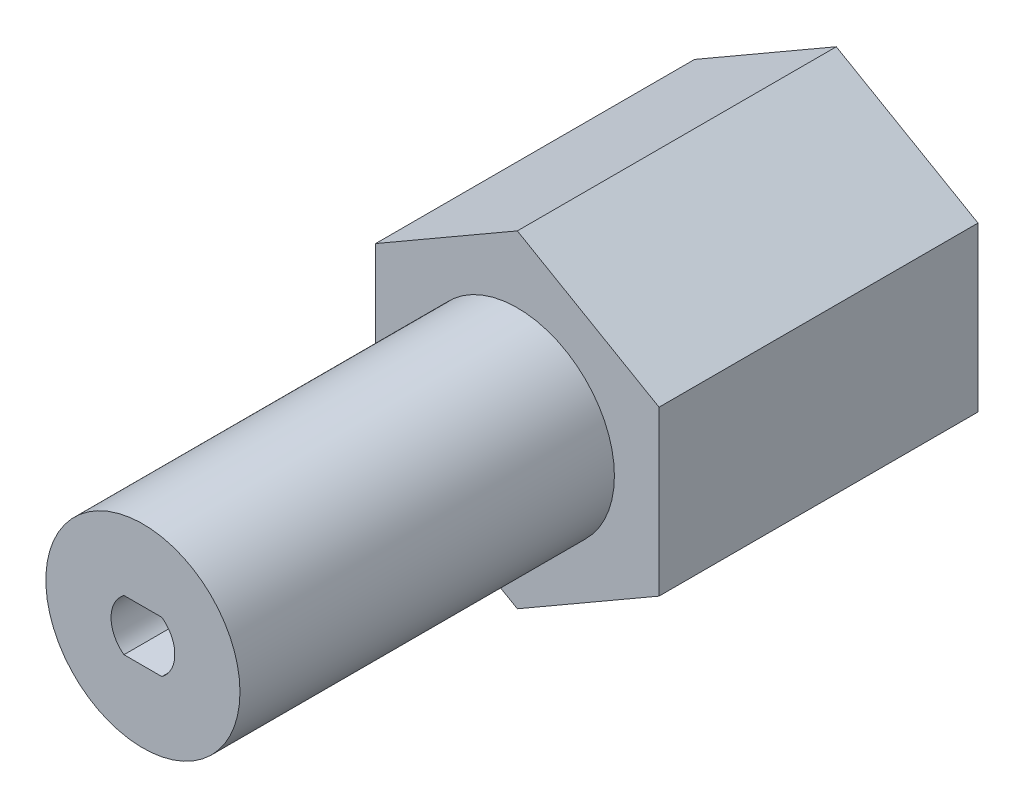
ISO-10303-21;
HEADER;
FILE_DESCRIPTION(('STEP AP214'),'2;1');
FILE_NAME('part.step','',(''),(''),'','','');
FILE_SCHEMA(('AUTOMOTIVE_DESIGN { 1 0 10303 214 1 1 1 1 }'));
ENDSEC;
DATA;
#1=APPLICATION_CONTEXT('core data for automotive mechanical design processes');
#2=APPLICATION_PROTOCOL_DEFINITION('international standard','automotive_design',2000,#1);
#3=PRODUCT_CONTEXT('',#1,'mechanical');
#4=PRODUCT('Part','Part','',(#3));
#5=PRODUCT_RELATED_PRODUCT_CATEGORY('part','',(#4));
#6=PRODUCT_DEFINITION_FORMATION('','',#4);
#7=PRODUCT_DEFINITION_CONTEXT('part definition',#1,'design');
#8=PRODUCT_DEFINITION('design','',#6,#7);
#9=PRODUCT_DEFINITION_SHAPE('','',#8);
#10=(LENGTH_UNIT() NAMED_UNIT(*) SI_UNIT(.MILLI.,.METRE.));
#11=(NAMED_UNIT(*) PLANE_ANGLE_UNIT() SI_UNIT($,.RADIAN.));
#12=(NAMED_UNIT(*) SI_UNIT($,.STERADIAN.) SOLID_ANGLE_UNIT());
#13=UNCERTAINTY_MEASURE_WITH_UNIT(LENGTH_MEASURE(1.E-05),#10,'distance_accuracy_value','');
#14=(GEOMETRIC_REPRESENTATION_CONTEXT(3) GLOBAL_UNCERTAINTY_ASSIGNED_CONTEXT((#13)) GLOBAL_UNIT_ASSIGNED_CONTEXT((#10,
#11,#12)) REPRESENTATION_CONTEXT('',''));
#15=CARTESIAN_POINT('',(0.,0.,0.));
#16=DIRECTION('',(0.,0.,1.));
#17=DIRECTION('',(1.,0.,0.));
#18=AXIS2_PLACEMENT_3D('',#15,#16,#17);
#19=CARTESIAN_POINT('',(0.,-5.9,11.5));
#20=DIRECTION('',(-0.5,0.866025403784439,0.));
#21=DIRECTION('',(-0.866025403784439,-0.5,0.));
#22=AXIS2_PLACEMENT_3D('',#19,#20,#21);
#23=PLANE('',#22);
#24=DIRECTION('',(0.866025403784439,0.5,0.));
#25=VECTOR('',#24,1.);
#26=CARTESIAN_POINT('',(0.,-5.9,0.));
#27=LINE('',#26,#25);
#28=CARTESIAN_POINT('',(0.,-5.9,0.));
#29=VERTEX_POINT('',#28);
#30=CARTESIAN_POINT('',(5.10954988232818,-2.95,0.));
#31=VERTEX_POINT('',#30);
#32=EDGE_CURVE('E152',#29,#31,#27,.T.);
#33=ORIENTED_EDGE('',*,*,#32,.T.);
#34=DIRECTION('',(0.,0.,-1.));
#35=VECTOR('',#34,1.);
#36=CARTESIAN_POINT('',(5.10954988232818,-2.95,11.5));
#37=LINE('',#36,#35);
#38=CARTESIAN_POINT('',(5.10954988232818,-2.95,11.5));
#39=VERTEX_POINT('',#38);
#40=EDGE_CURVE('E40',#39,#31,#37,.T.);
#41=ORIENTED_EDGE('',*,*,#40,.F.);
#42=DIRECTION('',(0.866025403784439,0.5,0.));
#43=VECTOR('',#42,1.);
#44=CARTESIAN_POINT('',(0.,-5.9,11.5));
#45=LINE('',#44,#43);
#46=CARTESIAN_POINT('',(0.,-5.9,11.5));
#47=VERTEX_POINT('',#46);
#48=EDGE_CURVE('E154',#47,#39,#45,.T.);
#49=ORIENTED_EDGE('',*,*,#48,.F.);
#50=DIRECTION('',(0.,0.,-1.));
#51=VECTOR('',#50,1.);
#52=CARTESIAN_POINT('',(0.,-5.9,11.5));
#53=LINE('',#52,#51);
#54=EDGE_CURVE('E168',#47,#29,#53,.T.);
#55=ORIENTED_EDGE('',*,*,#54,.T.);
#56=EDGE_LOOP('',(#33,#41,#49,#55));
#57=FACE_BOUND('',#56,.T.);
#58=ADVANCED_FACE('F37',(#57),#23,.F.);
#59=CARTESIAN_POINT('',(5.10954988232818,-2.95,11.5));
#60=DIRECTION('',(-1.,0.,0.));
#61=DIRECTION('',(0.,0.,1.));
#62=AXIS2_PLACEMENT_3D('',#59,#60,#61);
#63=PLANE('',#62);
#64=DIRECTION('',(0.,1.,0.));
#65=VECTOR('',#64,1.);
#66=CARTESIAN_POINT('',(5.10954988232818,-2.95,0.));
#67=LINE('',#66,#65);
#68=CARTESIAN_POINT('',(5.10954988232818,2.95,0.));
#69=VERTEX_POINT('',#68);
#70=EDGE_CURVE('E171',#31,#69,#67,.T.);
#71=ORIENTED_EDGE('',*,*,#70,.T.);
#72=DIRECTION('',(0.,0.,-1.));
#73=VECTOR('',#72,1.);
#74=CARTESIAN_POINT('',(5.10954988232818,2.95,11.5));
#75=LINE('',#74,#73);
#76=CARTESIAN_POINT('',(5.10954988232818,2.95,11.5));
#77=VERTEX_POINT('',#76);
#78=EDGE_CURVE('E190',#77,#69,#75,.T.);
#79=ORIENTED_EDGE('',*,*,#78,.F.);
#80=DIRECTION('',(0.,1.,0.));
#81=VECTOR('',#80,1.);
#82=CARTESIAN_POINT('',(5.10954988232818,-2.95,11.5));
#83=LINE('',#82,#81);
#84=EDGE_CURVE('E157',#39,#77,#83,.T.);
#85=ORIENTED_EDGE('',*,*,#84,.F.);
#86=ORIENTED_EDGE('',*,*,#40,.T.);
#87=EDGE_LOOP('',(#71,#79,#85,#86));
#88=FACE_BOUND('',#87,.T.);
#89=ADVANCED_FACE('F199',(#88),#63,.F.);
#90=CARTESIAN_POINT('',(5.10954988232818,2.95,11.5));
#91=DIRECTION('',(-0.5,-0.866025403784439,0.));
#92=DIRECTION('',(0.866025403784439,-0.5,0.));
#93=AXIS2_PLACEMENT_3D('',#90,#91,#92);
#94=PLANE('',#93);
#95=DIRECTION('',(-0.866025403784439,0.5,0.));
#96=VECTOR('',#95,1.);
#97=CARTESIAN_POINT('',(5.10954988232818,2.95,0.));
#98=LINE('',#97,#96);
#99=CARTESIAN_POINT('',(0.,5.9,0.));
#100=VERTEX_POINT('',#99);
#101=EDGE_CURVE('E173',#69,#100,#98,.T.);
#102=ORIENTED_EDGE('',*,*,#101,.T.);
#103=DIRECTION('',(0.,0.,-1.));
#104=VECTOR('',#103,1.);
#105=CARTESIAN_POINT('',(0.,5.9,11.5));
#106=LINE('',#105,#104);
#107=CARTESIAN_POINT('',(0.,5.9,11.5));
#108=VERTEX_POINT('',#107);
#109=EDGE_CURVE('E188',#108,#100,#106,.T.);
#110=ORIENTED_EDGE('',*,*,#109,.F.);
#111=DIRECTION('',(-0.866025403784439,0.5,0.));
#112=VECTOR('',#111,1.);
#113=CARTESIAN_POINT('',(5.10954988232818,2.95,11.5));
#114=LINE('',#113,#112);
#115=EDGE_CURVE('E160',#77,#108,#114,.T.);
#116=ORIENTED_EDGE('',*,*,#115,.F.);
#117=ORIENTED_EDGE('',*,*,#78,.T.);
#118=EDGE_LOOP('',(#102,#110,#116,#117));
#119=FACE_BOUND('',#118,.T.);
#120=ADVANCED_FACE('F208',(#119),#94,.F.);
#121=CARTESIAN_POINT('',(0.,5.9,11.5));
#122=DIRECTION('',(0.5,-0.866025403784439,0.));
#123=DIRECTION('',(0.866025403784439,0.5,0.));
#124=AXIS2_PLACEMENT_3D('',#121,#122,#123);
#125=PLANE('',#124);
#126=DIRECTION('',(-0.866025403784439,-0.5,0.));
#127=VECTOR('',#126,1.);
#128=CARTESIAN_POINT('',(0.,5.9,0.));
#129=LINE('',#128,#127);
#130=CARTESIAN_POINT('',(-5.10954988232819,2.95,0.));
#131=VERTEX_POINT('',#130);
#132=EDGE_CURVE('E175',#100,#131,#129,.T.);
#133=ORIENTED_EDGE('',*,*,#132,.T.);
#134=DIRECTION('',(0.,0.,-1.));
#135=VECTOR('',#134,1.);
#136=CARTESIAN_POINT('',(-5.10954988232819,2.95,11.5));
#137=LINE('',#136,#135);
#138=CARTESIAN_POINT('',(-5.10954988232819,2.95,11.5));
#139=VERTEX_POINT('',#138);
#140=EDGE_CURVE('E185',#139,#131,#137,.T.);
#141=ORIENTED_EDGE('',*,*,#140,.F.);
#142=DIRECTION('',(-0.866025403784439,-0.5,0.));
#143=VECTOR('',#142,1.);
#144=CARTESIAN_POINT('',(0.,5.9,11.5));
#145=LINE('',#144,#143);
#146=EDGE_CURVE('E162',#108,#139,#145,.T.);
#147=ORIENTED_EDGE('',*,*,#146,.F.);
#148=ORIENTED_EDGE('',*,*,#109,.T.);
#149=EDGE_LOOP('',(#133,#141,#147,#148));
#150=FACE_BOUND('',#149,.T.);
#151=ADVANCED_FACE('F211',(#150),#125,.F.);
#152=CARTESIAN_POINT('',(-5.10954988232819,2.95,11.5));
#153=DIRECTION('',(1.,0.,0.));
#154=DIRECTION('',(0.,0.,-1.));
#155=AXIS2_PLACEMENT_3D('',#152,#153,#154);
#156=PLANE('',#155);
#157=DIRECTION('',(0.,-1.,0.));
#158=VECTOR('',#157,1.);
#159=CARTESIAN_POINT('',(-5.10954988232819,2.95,0.));
#160=LINE('',#159,#158);
#161=CARTESIAN_POINT('',(-5.10954988232819,-2.95,0.));
#162=VERTEX_POINT('',#161);
#163=EDGE_CURVE('E177',#131,#162,#160,.T.);
#164=ORIENTED_EDGE('',*,*,#163,.T.);
#165=DIRECTION('',(0.,0.,-1.));
#166=VECTOR('',#165,1.);
#167=CARTESIAN_POINT('',(-5.10954988232819,-2.95,11.5));
#168=LINE('',#167,#166);
#169=CARTESIAN_POINT('',(-5.10954988232819,-2.95,11.5));
#170=VERTEX_POINT('',#169);
#171=EDGE_CURVE('E182',#170,#162,#168,.T.);
#172=ORIENTED_EDGE('',*,*,#171,.F.);
#173=DIRECTION('',(0.,-1.,0.));
#174=VECTOR('',#173,1.);
#175=CARTESIAN_POINT('',(-5.10954988232819,2.95,11.5));
#176=LINE('',#175,#174);
#177=EDGE_CURVE('E164',#139,#170,#176,.T.);
#178=ORIENTED_EDGE('',*,*,#177,.F.);
#179=ORIENTED_EDGE('',*,*,#140,.T.);
#180=EDGE_LOOP('',(#164,#172,#178,#179));
#181=FACE_BOUND('',#180,.T.);
#182=ADVANCED_FACE('F221',(#181),#156,.F.);
#183=CARTESIAN_POINT('',(-5.10954988232819,-2.95,11.5));
#184=DIRECTION('',(0.5,0.866025403784438,0.));
#185=DIRECTION('',(-0.866025403784438,0.5,0.));
#186=AXIS2_PLACEMENT_3D('',#183,#184,#185);
#187=PLANE('',#186);
#188=DIRECTION('',(0.866025403784438,-0.5,0.));
#189=VECTOR('',#188,1.);
#190=CARTESIAN_POINT('',(-5.10954988232819,-2.95,0.));
#191=LINE('',#190,#189);
#192=EDGE_CURVE('E158',#162,#29,#191,.T.);
#193=ORIENTED_EDGE('',*,*,#192,.T.);
#194=ORIENTED_EDGE('',*,*,#54,.F.);
#195=DIRECTION('',(0.866025403784438,-0.5,0.));
#196=VECTOR('',#195,1.);
#197=CARTESIAN_POINT('',(-5.10954988232819,-2.95,11.5));
#198=LINE('',#197,#196);
#199=EDGE_CURVE('E166',#170,#47,#198,.T.);
#200=ORIENTED_EDGE('',*,*,#199,.F.);
#201=ORIENTED_EDGE('',*,*,#171,.T.);
#202=EDGE_LOOP('',(#193,#194,#200,#201));
#203=FACE_BOUND('',#202,.T.);
#204=ADVANCED_FACE('F219',(#203),#187,.F.);
#205=CARTESIAN_POINT('',(0.,0.,11.5));
#206=DIRECTION('',(0.,0.,1.));
#207=DIRECTION('',(1.,0.,0.));
#208=AXIS2_PLACEMENT_3D('',#205,#206,#207);
#209=PLANE('',#208);
#210=CARTESIAN_POINT('',(0.,0.,11.5));
#211=DIRECTION('',(0.,0.,1.));
#212=DIRECTION('',(1.,0.,0.));
#213=AXIS2_PLACEMENT_3D('',#210,#211,#212);
#214=CIRCLE('',#213,3.5);
#215=CARTESIAN_POINT('',(3.5,0.,11.5));
#216=VERTEX_POINT('',#215);
#217=EDGE_CURVE('E11',#216,#216,#214,.T.);
#218=ORIENTED_EDGE('',*,*,#217,.F.);
#219=EDGE_LOOP('',(#218));
#220=FACE_BOUND('',#219,.T.);
#221=ORIENTED_EDGE('',*,*,#48,.T.);
#222=ORIENTED_EDGE('',*,*,#84,.T.);
#223=ORIENTED_EDGE('',*,*,#115,.T.);
#224=ORIENTED_EDGE('',*,*,#146,.T.);
#225=ORIENTED_EDGE('',*,*,#177,.T.);
#226=ORIENTED_EDGE('',*,*,#199,.T.);
#227=EDGE_LOOP('',(#221,#222,#223,#224,#225,#226));
#228=FACE_BOUND('',#227,.T.);
#229=ADVANCED_FACE('F215',(#220,#228),#209,.T.);
#230=CARTESIAN_POINT('',(0.,0.,0.));
#231=DIRECTION('',(0.,0.,1.));
#232=DIRECTION('',(1.,0.,0.));
#233=AXIS2_PLACEMENT_3D('',#230,#231,#232);
#234=PLANE('',#233);
#235=DIRECTION('',(-1.,0.,0.));
#236=VECTOR('',#235,1.);
#237=CARTESIAN_POINT('',(-0.683282518435823,0.925,0.));
#238=LINE('',#237,#236);
#239=CARTESIAN_POINT('',(0.683282518435823,0.925,0.));
#240=VERTEX_POINT('',#239);
#241=CARTESIAN_POINT('',(-0.683282518435823,0.925,0.));
#242=VERTEX_POINT('',#241);
#243=EDGE_CURVE('E122',#240,#242,#238,.T.);
#244=ORIENTED_EDGE('',*,*,#243,.T.);
#245=CARTESIAN_POINT('',(0.,0.,0.));
#246=DIRECTION('',(0.,0.,1.));
#247=DIRECTION('',(-1.,0.,0.));
#248=AXIS2_PLACEMENT_3D('',#245,#246,#247);
#249=CIRCLE('',#248,1.15);
#250=CARTESIAN_POINT('',(-0.683282518435823,-0.925,0.));
#251=VERTEX_POINT('',#250);
#252=EDGE_CURVE('E116',#242,#251,#249,.T.);
#253=ORIENTED_EDGE('',*,*,#252,.T.);
#254=DIRECTION('',(1.,0.,0.));
#255=VECTOR('',#254,1.);
#256=CARTESIAN_POINT('',(-0.683282518435823,-0.925,0.));
#257=LINE('',#256,#255);
#258=CARTESIAN_POINT('',(0.683282518435822,-0.925,0.));
#259=VERTEX_POINT('',#258);
#260=EDGE_CURVE('E125',#251,#259,#257,.T.);
#261=ORIENTED_EDGE('',*,*,#260,.T.);
#262=CARTESIAN_POINT('',(0.,0.,0.));
#263=DIRECTION('',(0.,0.,1.));
#264=DIRECTION('',(-1.,0.,0.));
#265=AXIS2_PLACEMENT_3D('',#262,#263,#264);
#266=CIRCLE('',#265,1.15);
#267=EDGE_CURVE('E52',#259,#240,#266,.T.);
#268=ORIENTED_EDGE('',*,*,#267,.T.);
#269=EDGE_LOOP('',(#244,#253,#261,#268));
#270=FACE_BOUND('',#269,.T.);
#271=ORIENTED_EDGE('',*,*,#32,.F.);
#272=ORIENTED_EDGE('',*,*,#192,.F.);
#273=ORIENTED_EDGE('',*,*,#163,.F.);
#274=ORIENTED_EDGE('',*,*,#132,.F.);
#275=ORIENTED_EDGE('',*,*,#101,.F.);
#276=ORIENTED_EDGE('',*,*,#70,.F.);
#277=EDGE_LOOP('',(#271,#272,#273,#274,#275,#276));
#278=FACE_BOUND('',#277,.T.);
#279=ADVANCED_FACE('F129',(#270,#278),#234,.F.);
#280=CARTESIAN_POINT('',(0.,0.,25.));
#281=DIRECTION('',(0.,0.,-1.));
#282=DIRECTION('',(-1.,0.,0.));
#283=AXIS2_PLACEMENT_3D('',#280,#281,#282);
#284=CYLINDRICAL_SURFACE('',#283,3.5);
#285=CARTESIAN_POINT('',(0.,0.,25.));
#286=DIRECTION('',(0.,0.,1.));
#287=DIRECTION('',(1.,0.,0.));
#288=AXIS2_PLACEMENT_3D('',#285,#286,#287);
#289=CIRCLE('',#288,3.5);
#290=CARTESIAN_POINT('',(3.5,0.,25.));
#291=VERTEX_POINT('',#290);
#292=EDGE_CURVE('E147',#291,#291,#289,.T.);
#293=ORIENTED_EDGE('',*,*,#292,.F.);
#294=EDGE_LOOP('',(#293));
#295=FACE_BOUND('',#294,.T.);
#296=ORIENTED_EDGE('',*,*,#217,.T.);
#297=EDGE_LOOP('',(#296));
#298=FACE_BOUND('',#297,.T.);
#299=ADVANCED_FACE('F274',(#295,#298),#284,.T.);
#300=CARTESIAN_POINT('',(0.,0.,25.));
#301=DIRECTION('',(0.,0.,1.));
#302=DIRECTION('',(1.,0.,0.));
#303=AXIS2_PLACEMENT_3D('',#300,#301,#302);
#304=PLANE('',#303);
#305=CARTESIAN_POINT('',(0.,0.,25.));
#306=DIRECTION('',(0.,0.,1.));
#307=DIRECTION('',(-1.,0.,0.));
#308=AXIS2_PLACEMENT_3D('',#305,#306,#307);
#309=CIRCLE('',#308,1.15);
#310=CARTESIAN_POINT('',(-0.683282518435823,0.925,25.));
#311=VERTEX_POINT('',#310);
#312=CARTESIAN_POINT('',(-0.683282518435823,-0.925,25.));
#313=VERTEX_POINT('',#312);
#314=EDGE_CURVE('E60',#311,#313,#309,.T.);
#315=ORIENTED_EDGE('',*,*,#314,.F.);
#316=DIRECTION('',(-1.,0.,0.));
#317=VECTOR('',#316,1.);
#318=CARTESIAN_POINT('',(-0.683282518435823,0.925,25.));
#319=LINE('',#318,#317);
#320=CARTESIAN_POINT('',(0.683282518435823,0.925,25.));
#321=VERTEX_POINT('',#320);
#322=EDGE_CURVE('E132',#321,#311,#319,.T.);
#323=ORIENTED_EDGE('',*,*,#322,.F.);
#324=CARTESIAN_POINT('',(0.,0.,25.));
#325=DIRECTION('',(0.,0.,1.));
#326=DIRECTION('',(-1.,0.,0.));
#327=AXIS2_PLACEMENT_3D('',#324,#325,#326);
#328=CIRCLE('',#327,1.15);
#329=CARTESIAN_POINT('',(0.683282518435822,-0.925,25.));
#330=VERTEX_POINT('',#329);
#331=EDGE_CURVE('E135',#330,#321,#328,.T.);
#332=ORIENTED_EDGE('',*,*,#331,.F.);
#333=DIRECTION('',(1.,0.,0.));
#334=VECTOR('',#333,1.);
#335=CARTESIAN_POINT('',(-0.683282518435823,-0.925,25.));
#336=LINE('',#335,#334);
#337=EDGE_CURVE('E141',#313,#330,#336,.T.);
#338=ORIENTED_EDGE('',*,*,#337,.F.);
#339=EDGE_LOOP('',(#315,#323,#332,#338));
#340=FACE_BOUND('',#339,.T.);
#341=ORIENTED_EDGE('',*,*,#292,.T.);
#342=EDGE_LOOP('',(#341));
#343=FACE_BOUND('',#342,.T.);
#344=ADVANCED_FACE('F279',(#340,#343),#304,.T.);
#345=CARTESIAN_POINT('',(0.,0.,0.));
#346=DIRECTION('',(0.,0.,1.));
#347=DIRECTION('',(1.,0.,0.));
#348=AXIS2_PLACEMENT_3D('',#345,#346,#347);
#349=CYLINDRICAL_SURFACE('',#348,1.15);
#350=ORIENTED_EDGE('',*,*,#314,.T.);
#351=DIRECTION('',(0.,0.,1.));
#352=VECTOR('',#351,1.);
#353=CARTESIAN_POINT('',(-0.683282518435823,-0.925,0.));
#354=LINE('',#353,#352);
#355=EDGE_CURVE('E112',#251,#313,#354,.T.);
#356=ORIENTED_EDGE('',*,*,#355,.F.);
#357=ORIENTED_EDGE('',*,*,#252,.F.);
#358=DIRECTION('',(0.,0.,1.));
#359=VECTOR('',#358,1.);
#360=CARTESIAN_POINT('',(-0.683282518435823,0.925,0.));
#361=LINE('',#360,#359);
#362=EDGE_CURVE('E145',#242,#311,#361,.T.);
#363=ORIENTED_EDGE('',*,*,#362,.T.);
#364=EDGE_LOOP('',(#350,#356,#357,#363));
#365=FACE_BOUND('',#364,.T.);
#366=ADVANCED_FACE('F114',(#365),#349,.F.);
#367=CARTESIAN_POINT('',(-0.683282518435823,0.925,0.));
#368=DIRECTION('',(0.,1.,0.));
#369=DIRECTION('',(0.,0.,1.));
#370=AXIS2_PLACEMENT_3D('',#367,#368,#369);
#371=PLANE('',#370);
#372=ORIENTED_EDGE('',*,*,#322,.T.);
#373=ORIENTED_EDGE('',*,*,#362,.F.);
#374=ORIENTED_EDGE('',*,*,#243,.F.);
#375=DIRECTION('',(0.,0.,1.));
#376=VECTOR('',#375,1.);
#377=CARTESIAN_POINT('',(0.683282518435823,0.925,0.));
#378=LINE('',#377,#376);
#379=EDGE_CURVE('E148',#240,#321,#378,.T.);
#380=ORIENTED_EDGE('',*,*,#379,.T.);
#381=EDGE_LOOP('',(#372,#373,#374,#380));
#382=FACE_BOUND('',#381,.T.);
#383=ADVANCED_FACE('F307',(#382),#371,.F.);
#384=CARTESIAN_POINT('',(0.,0.,0.));
#385=DIRECTION('',(0.,0.,1.));
#386=DIRECTION('',(1.,0.,0.));
#387=AXIS2_PLACEMENT_3D('',#384,#385,#386);
#388=CYLINDRICAL_SURFACE('',#387,1.15);
#389=ORIENTED_EDGE('',*,*,#331,.T.);
#390=ORIENTED_EDGE('',*,*,#379,.F.);
#391=ORIENTED_EDGE('',*,*,#267,.F.);
#392=DIRECTION('',(0.,0.,1.));
#393=VECTOR('',#392,1.);
#394=CARTESIAN_POINT('',(0.683282518435822,-0.925,0.));
#395=LINE('',#394,#393);
#396=EDGE_CURVE('E121',#259,#330,#395,.T.);
#397=ORIENTED_EDGE('',*,*,#396,.T.);
#398=EDGE_LOOP('',(#389,#390,#391,#397));
#399=FACE_BOUND('',#398,.T.);
#400=ADVANCED_FACE('F317',(#399),#388,.F.);
#401=CARTESIAN_POINT('',(-0.683282518435823,-0.925,0.));
#402=DIRECTION('',(0.,-1.,0.));
#403=DIRECTION('',(0.,0.,-1.));
#404=AXIS2_PLACEMENT_3D('',#401,#402,#403);
#405=PLANE('',#404);
#406=ORIENTED_EDGE('',*,*,#337,.T.);
#407=ORIENTED_EDGE('',*,*,#396,.F.);
#408=ORIENTED_EDGE('',*,*,#260,.F.);
#409=ORIENTED_EDGE('',*,*,#355,.T.);
#410=EDGE_LOOP('',(#406,#407,#408,#409));
#411=FACE_BOUND('',#410,.T.);
#412=ADVANCED_FACE('F126',(#411),#405,.F.);
#413=CLOSED_SHELL('',(#58,#89,#120,#151,#182,#204,#229,#279,#299,#344,#366,#383,#400,#412));
#414=MANIFOLD_SOLID_BREP('B2',#413);
#415=ADVANCED_BREP_SHAPE_REPRESENTATION('',(#18,#414),#14);
#416=SHAPE_DEFINITION_REPRESENTATION(#9,#415);
ENDSEC;
END-ISO-10303-21;
